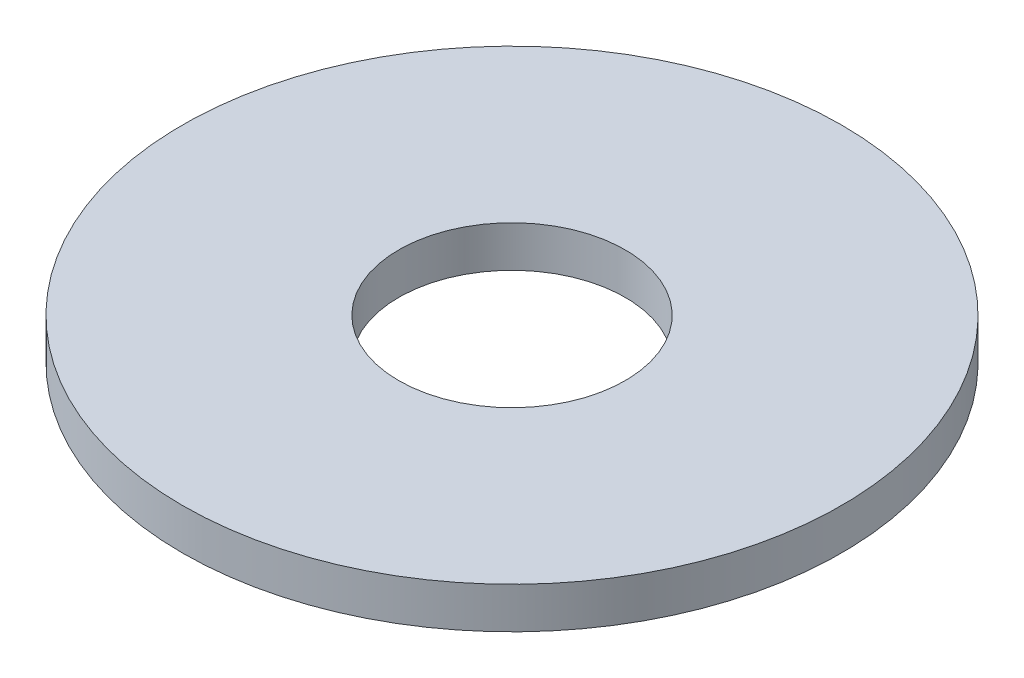
ISO-10303-21;
HEADER;
FILE_DESCRIPTION(('STEP AP214'),'2;1');
FILE_NAME('part.step','',(''),(''),'','','');
FILE_SCHEMA(('AUTOMOTIVE_DESIGN { 1 0 10303 214 1 1 1 1 }'));
ENDSEC;
DATA;
#1=APPLICATION_CONTEXT('core data for automotive mechanical design processes');
#2=APPLICATION_PROTOCOL_DEFINITION('international standard','automotive_design',2000,#1);
#3=PRODUCT_CONTEXT('',#1,'mechanical');
#4=PRODUCT('Part','Part','',(#3));
#5=PRODUCT_RELATED_PRODUCT_CATEGORY('part','',(#4));
#6=PRODUCT_DEFINITION_FORMATION('','',#4);
#7=PRODUCT_DEFINITION_CONTEXT('part definition',#1,'design');
#8=PRODUCT_DEFINITION('design','',#6,#7);
#9=PRODUCT_DEFINITION_SHAPE('','',#8);
#10=(LENGTH_UNIT() NAMED_UNIT(*) SI_UNIT(.MILLI.,.METRE.));
#11=(NAMED_UNIT(*) PLANE_ANGLE_UNIT() SI_UNIT($,.RADIAN.));
#12=(NAMED_UNIT(*) SI_UNIT($,.STERADIAN.) SOLID_ANGLE_UNIT());
#13=UNCERTAINTY_MEASURE_WITH_UNIT(LENGTH_MEASURE(1.E-05),#10,'distance_accuracy_value','');
#14=(GEOMETRIC_REPRESENTATION_CONTEXT(3) GLOBAL_UNCERTAINTY_ASSIGNED_CONTEXT((#13)) GLOBAL_UNIT_ASSIGNED_CONTEXT((#10,
#11,#12)) REPRESENTATION_CONTEXT('',''));
#15=CARTESIAN_POINT('',(0.,0.,0.));
#16=DIRECTION('',(0.,0.,1.));
#17=DIRECTION('',(1.,0.,0.));
#18=AXIS2_PLACEMENT_3D('',#15,#16,#17);
#19=CARTESIAN_POINT('',(0.,1.,0.));
#20=DIRECTION('',(0.,1.,0.));
#21=DIRECTION('',(0.,0.,1.));
#22=AXIS2_PLACEMENT_3D('',#19,#20,#21);
#23=PLANE('',#22);
#24=CARTESIAN_POINT('',(0.,1.,0.));
#25=DIRECTION('',(0.,1.,0.));
#26=DIRECTION('',(0.,0.,1.));
#27=AXIS2_PLACEMENT_3D('',#24,#25,#26);
#28=CIRCLE('',#27,8.);
#29=CARTESIAN_POINT('',(0.,1.,8.));
#30=VERTEX_POINT('',#29);
#31=EDGE_CURVE('E10',#30,#30,#28,.T.);
#32=ORIENTED_EDGE('',*,*,#31,.T.);
#33=EDGE_LOOP('',(#32));
#34=FACE_BOUND('',#33,.T.);
#35=CARTESIAN_POINT('',(0.,1.,0.));
#36=DIRECTION('',(0.,1.,0.));
#37=DIRECTION('',(0.,0.,1.));
#38=AXIS2_PLACEMENT_3D('',#35,#36,#37);
#39=CIRCLE('',#38,2.75);
#40=CARTESIAN_POINT('',(0.,1.,2.75));
#41=VERTEX_POINT('',#40);
#42=EDGE_CURVE('E26',#41,#41,#39,.T.);
#43=ORIENTED_EDGE('',*,*,#42,.F.);
#44=EDGE_LOOP('',(#43));
#45=FACE_BOUND('',#44,.T.);
#46=ADVANCED_FACE('F15',(#34,#45),#23,.T.);
#47=CARTESIAN_POINT('',(0.,0.,0.));
#48=DIRECTION('',(0.,1.,0.));
#49=DIRECTION('',(0.,0.,1.));
#50=AXIS2_PLACEMENT_3D('',#47,#48,#49);
#51=PLANE('',#50);
#52=CARTESIAN_POINT('',(0.,0.,0.));
#53=DIRECTION('',(0.,1.,0.));
#54=DIRECTION('',(0.,0.,1.));
#55=AXIS2_PLACEMENT_3D('',#52,#53,#54);
#56=CIRCLE('',#55,8.);
#57=CARTESIAN_POINT('',(0.,0.,8.));
#58=VERTEX_POINT('',#57);
#59=EDGE_CURVE('E19',#58,#58,#56,.T.);
#60=ORIENTED_EDGE('',*,*,#59,.F.);
#61=EDGE_LOOP('',(#60));
#62=FACE_BOUND('',#61,.T.);
#63=CARTESIAN_POINT('',(0.,0.,0.));
#64=DIRECTION('',(0.,1.,0.));
#65=DIRECTION('',(0.,0.,1.));
#66=AXIS2_PLACEMENT_3D('',#63,#64,#65);
#67=CIRCLE('',#66,2.75);
#68=CARTESIAN_POINT('',(0.,0.,2.75));
#69=VERTEX_POINT('',#68);
#70=EDGE_CURVE('E28',#69,#69,#67,.T.);
#71=ORIENTED_EDGE('',*,*,#70,.T.);
#72=EDGE_LOOP('',(#71));
#73=FACE_BOUND('',#72,.T.);
#74=ADVANCED_FACE('F38',(#62,#73),#51,.F.);
#75=CARTESIAN_POINT('',(0.,1.,0.));
#76=DIRECTION('',(0.,-1.,0.));
#77=DIRECTION('',(0.,0.,-1.));
#78=AXIS2_PLACEMENT_3D('',#75,#76,#77);
#79=CYLINDRICAL_SURFACE('',#78,8.);
#80=ORIENTED_EDGE('',*,*,#31,.F.);
#81=EDGE_LOOP('',(#80));
#82=FACE_BOUND('',#81,.T.);
#83=ORIENTED_EDGE('',*,*,#59,.T.);
#84=EDGE_LOOP('',(#83));
#85=FACE_BOUND('',#84,.T.);
#86=ADVANCED_FACE('F17',(#82,#85),#79,.T.);
#87=CARTESIAN_POINT('',(0.,1.,0.));
#88=DIRECTION('',(0.,-1.,0.));
#89=DIRECTION('',(0.,0.,-1.));
#90=AXIS2_PLACEMENT_3D('',#87,#88,#89);
#91=CYLINDRICAL_SURFACE('',#90,2.75);
#92=ORIENTED_EDGE('',*,*,#42,.T.);
#93=EDGE_LOOP('',(#92));
#94=FACE_BOUND('',#93,.T.);
#95=ORIENTED_EDGE('',*,*,#70,.F.);
#96=EDGE_LOOP('',(#95));
#97=FACE_BOUND('',#96,.T.);
#98=ADVANCED_FACE('F34',(#94,#97),#91,.F.);
#99=CLOSED_SHELL('',(#46,#74,#86,#98));
#100=MANIFOLD_SOLID_BREP('B1',#99);
#101=ADVANCED_BREP_SHAPE_REPRESENTATION('',(#18,#100),#14);
#102=SHAPE_DEFINITION_REPRESENTATION(#9,#101);
ENDSEC;
END-ISO-10303-21;
